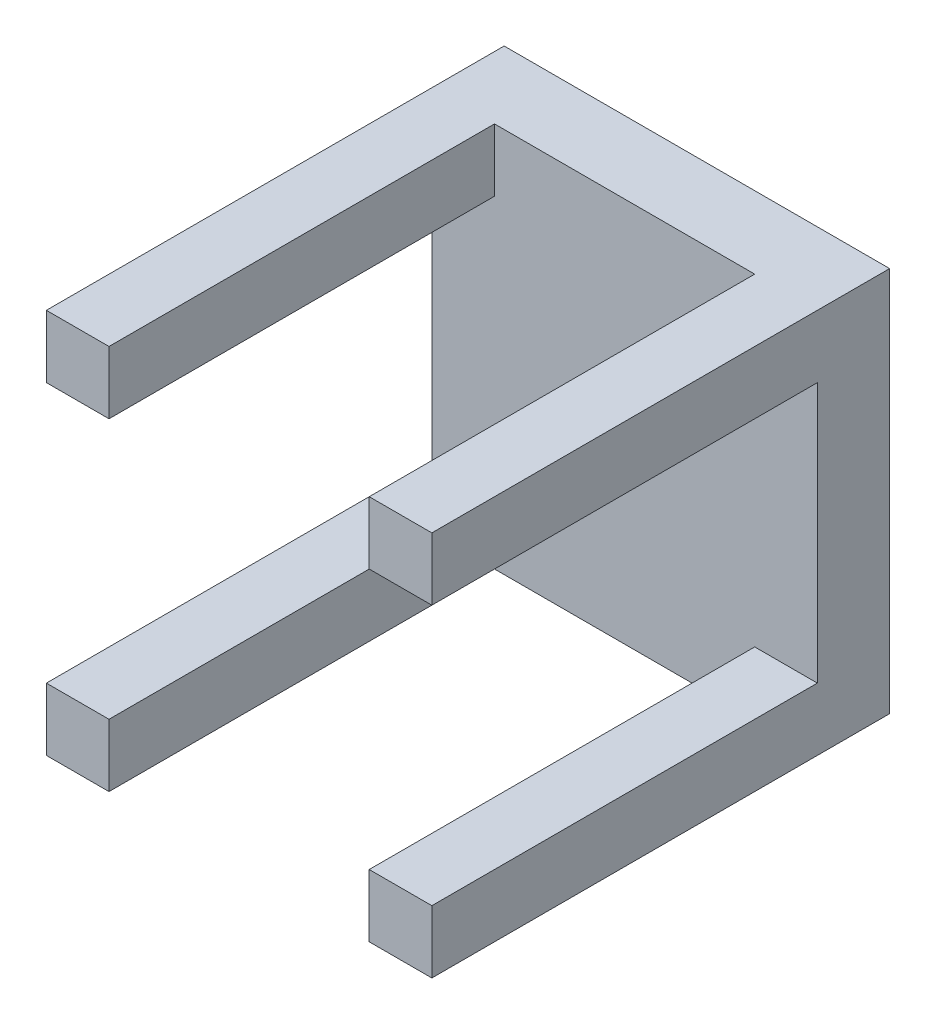
ISO-10303-21;
HEADER;
FILE_DESCRIPTION(('STEP AP214'),'2;1');
FILE_NAME('part.step','',(''),(''),'','','');
FILE_SCHEMA(('AUTOMOTIVE_DESIGN { 1 0 10303 214 1 1 1 1 }'));
ENDSEC;
DATA;
#1=APPLICATION_CONTEXT('core data for automotive mechanical design processes');
#2=APPLICATION_PROTOCOL_DEFINITION('international standard','automotive_design',2000,#1);
#3=PRODUCT_CONTEXT('',#1,'mechanical');
#4=PRODUCT('Part','Part','',(#3));
#5=PRODUCT_RELATED_PRODUCT_CATEGORY('part','',(#4));
#6=PRODUCT_DEFINITION_FORMATION('','',#4);
#7=PRODUCT_DEFINITION_CONTEXT('part definition',#1,'design');
#8=PRODUCT_DEFINITION('design','',#6,#7);
#9=PRODUCT_DEFINITION_SHAPE('','',#8);
#10=(LENGTH_UNIT() NAMED_UNIT(*) SI_UNIT(.MILLI.,.METRE.));
#11=(NAMED_UNIT(*) PLANE_ANGLE_UNIT() SI_UNIT($,.RADIAN.));
#12=(NAMED_UNIT(*) SI_UNIT($,.STERADIAN.) SOLID_ANGLE_UNIT());
#13=UNCERTAINTY_MEASURE_WITH_UNIT(LENGTH_MEASURE(1.E-05),#10,'distance_accuracy_value','');
#14=(GEOMETRIC_REPRESENTATION_CONTEXT(3) GLOBAL_UNCERTAINTY_ASSIGNED_CONTEXT((#13)) GLOBAL_UNIT_ASSIGNED_CONTEXT((#10,
#11,#12)) REPRESENTATION_CONTEXT('',''));
#15=CARTESIAN_POINT('',(0.,0.,0.));
#16=DIRECTION('',(0.,0.,1.));
#17=DIRECTION('',(1.,0.,0.));
#18=AXIS2_PLACEMENT_3D('',#15,#16,#17);
#19=CARTESIAN_POINT('',(0.,0.,15.));
#20=DIRECTION('',(0.,0.,1.));
#21=DIRECTION('',(1.,0.,0.));
#22=AXIS2_PLACEMENT_3D('',#19,#20,#21);
#23=PLANE('',#22);
#24=DIRECTION('',(0.,-1.,0.));
#25=VECTOR('',#24,1.);
#26=CARTESIAN_POINT('',(27.,-40.,15.));
#27=LINE('',#26,#25);
#28=CARTESIAN_POINT('',(27.,-27.,15.));
#29=VERTEX_POINT('',#28);
#30=CARTESIAN_POINT('',(27.,-40.,15.));
#31=VERTEX_POINT('',#30);
#32=EDGE_CURVE('E51',#29,#31,#27,.T.);
#33=ORIENTED_EDGE('',*,*,#32,.F.);
#34=DIRECTION('',(-1.,0.,0.));
#35=VECTOR('',#34,1.);
#36=CARTESIAN_POINT('',(40.,-27.,15.));
#37=LINE('',#36,#35);
#38=CARTESIAN_POINT('',(40.,-27.,15.));
#39=VERTEX_POINT('',#38);
#40=EDGE_CURVE('E55',#39,#29,#37,.T.);
#41=ORIENTED_EDGE('',*,*,#40,.F.);
#42=DIRECTION('',(0.,-1.,0.));
#43=VECTOR('',#42,1.);
#44=CARTESIAN_POINT('',(40.,0.,15.));
#45=LINE('',#44,#43);
#46=CARTESIAN_POINT('',(40.,27.,15.));
#47=VERTEX_POINT('',#46);
#48=EDGE_CURVE('E168',#47,#39,#45,.T.);
#49=ORIENTED_EDGE('',*,*,#48,.F.);
#50=DIRECTION('',(1.,0.,0.));
#51=VECTOR('',#50,1.);
#52=CARTESIAN_POINT('',(40.,27.,15.));
#53=LINE('',#52,#51);
#54=CARTESIAN_POINT('',(27.,27.,15.));
#55=VERTEX_POINT('',#54);
#56=EDGE_CURVE('E203',#55,#47,#53,.T.);
#57=ORIENTED_EDGE('',*,*,#56,.F.);
#58=DIRECTION('',(0.,-1.,0.));
#59=VECTOR('',#58,1.);
#60=CARTESIAN_POINT('',(27.,40.,15.));
#61=LINE('',#60,#59);
#62=CARTESIAN_POINT('',(27.,40.,15.));
#63=VERTEX_POINT('',#62);
#64=EDGE_CURVE('E198',#63,#55,#61,.T.);
#65=ORIENTED_EDGE('',*,*,#64,.F.);
#66=DIRECTION('',(1.,0.,0.));
#67=VECTOR('',#66,1.);
#68=CARTESIAN_POINT('',(0.,40.,15.));
#69=LINE('',#68,#67);
#70=CARTESIAN_POINT('',(-27.,40.,15.));
#71=VERTEX_POINT('',#70);
#72=EDGE_CURVE('E245',#71,#63,#69,.T.);
#73=ORIENTED_EDGE('',*,*,#72,.F.);
#74=DIRECTION('',(0.,1.,0.));
#75=VECTOR('',#74,1.);
#76=CARTESIAN_POINT('',(-27.,40.,15.));
#77=LINE('',#76,#75);
#78=CARTESIAN_POINT('',(-27.,27.,15.));
#79=VERTEX_POINT('',#78);
#80=EDGE_CURVE('E223',#79,#71,#77,.T.);
#81=ORIENTED_EDGE('',*,*,#80,.F.);
#82=DIRECTION('',(1.,0.,0.));
#83=VECTOR('',#82,1.);
#84=CARTESIAN_POINT('',(-40.,27.,15.));
#85=LINE('',#84,#83);
#86=CARTESIAN_POINT('',(-40.,27.,15.));
#87=VERTEX_POINT('',#86);
#88=EDGE_CURVE('E218',#87,#79,#85,.T.);
#89=ORIENTED_EDGE('',*,*,#88,.F.);
#90=DIRECTION('',(0.,-1.,0.));
#91=VECTOR('',#90,1.);
#92=CARTESIAN_POINT('',(-40.,0.,15.));
#93=LINE('',#92,#91);
#94=CARTESIAN_POINT('',(-40.,-27.,15.));
#95=VERTEX_POINT('',#94);
#96=EDGE_CURVE('E249',#87,#95,#93,.T.);
#97=ORIENTED_EDGE('',*,*,#96,.T.);
#98=DIRECTION('',(-1.,0.,0.));
#99=VECTOR('',#98,1.);
#100=CARTESIAN_POINT('',(-40.,-27.,15.));
#101=LINE('',#100,#99);
#102=CARTESIAN_POINT('',(-27.,-27.,15.));
#103=VERTEX_POINT('',#102);
#104=EDGE_CURVE('E172',#103,#95,#101,.T.);
#105=ORIENTED_EDGE('',*,*,#104,.F.);
#106=DIRECTION('',(0.,1.,0.));
#107=VECTOR('',#106,1.);
#108=CARTESIAN_POINT('',(-27.,-40.,15.));
#109=LINE('',#108,#107);
#110=CARTESIAN_POINT('',(-27.,-40.,15.));
#111=VERTEX_POINT('',#110);
#112=EDGE_CURVE('E169',#111,#103,#109,.T.);
#113=ORIENTED_EDGE('',*,*,#112,.F.);
#114=DIRECTION('',(1.,0.,0.));
#115=VECTOR('',#114,1.);
#116=CARTESIAN_POINT('',(0.,-40.,15.));
#117=LINE('',#116,#115);
#118=EDGE_CURVE('E251',#111,#31,#117,.T.);
#119=ORIENTED_EDGE('',*,*,#118,.T.);
#120=EDGE_LOOP('',(#33,#41,#49,#57,#65,#73,#81,#89,#97,#105,#113,#119));
#121=FACE_BOUND('',#120,.T.);
#122=ADVANCED_FACE('F36',(#121),#23,.T.);
#123=CARTESIAN_POINT('',(40.,0.,15.));
#124=DIRECTION('',(1.,0.,0.));
#125=DIRECTION('',(0.,1.,0.));
#126=AXIS2_PLACEMENT_3D('',#123,#124,#125);
#127=PLANE('',#126);
#128=DIRECTION('',(0.,-1.,0.));
#129=VECTOR('',#128,1.);
#130=CARTESIAN_POINT('',(40.,0.,0.));
#131=LINE('',#130,#129);
#132=CARTESIAN_POINT('',(40.,40.,0.));
#133=VERTEX_POINT('',#132);
#134=CARTESIAN_POINT('',(40.,-40.,0.));
#135=VERTEX_POINT('',#134);
#136=EDGE_CURVE('E243',#133,#135,#131,.T.);
#137=ORIENTED_EDGE('',*,*,#136,.F.);
#138=DIRECTION('',(0.,0.,-1.));
#139=VECTOR('',#138,1.);
#140=CARTESIAN_POINT('',(40.,40.,15.));
#141=LINE('',#140,#139);
#142=CARTESIAN_POINT('',(40.,40.,95.));
#143=VERTEX_POINT('',#142);
#144=EDGE_CURVE('E11',#143,#133,#141,.T.);
#145=ORIENTED_EDGE('',*,*,#144,.F.);
#146=DIRECTION('',(0.,1.,0.));
#147=VECTOR('',#146,1.);
#148=CARTESIAN_POINT('',(40.,40.,95.));
#149=LINE('',#148,#147);
#150=CARTESIAN_POINT('',(40.,27.,95.));
#151=VERTEX_POINT('',#150);
#152=EDGE_CURVE('E199',#151,#143,#149,.T.);
#153=ORIENTED_EDGE('',*,*,#152,.F.);
#154=DIRECTION('',(0.,0.,-1.));
#155=VECTOR('',#154,1.);
#156=CARTESIAN_POINT('',(40.,27.,95.));
#157=LINE('',#156,#155);
#158=EDGE_CURVE('E209',#151,#47,#157,.T.);
#159=ORIENTED_EDGE('',*,*,#158,.T.);
#160=ORIENTED_EDGE('',*,*,#48,.T.);
#161=DIRECTION('',(0.,0.,-1.));
#162=VECTOR('',#161,1.);
#163=CARTESIAN_POINT('',(40.,-27.,95.));
#164=LINE('',#163,#162);
#165=CARTESIAN_POINT('',(40.,-27.,95.));
#166=VERTEX_POINT('',#165);
#167=EDGE_CURVE('E151',#166,#39,#164,.T.);
#168=ORIENTED_EDGE('',*,*,#167,.F.);
#169=DIRECTION('',(0.,1.,0.));
#170=VECTOR('',#169,1.);
#171=CARTESIAN_POINT('',(40.,-40.,95.));
#172=LINE('',#171,#170);
#173=CARTESIAN_POINT('',(40.,-40.,95.));
#174=VERTEX_POINT('',#173);
#175=EDGE_CURVE('E157',#174,#166,#172,.T.);
#176=ORIENTED_EDGE('',*,*,#175,.F.);
#177=DIRECTION('',(0.,0.,-1.));
#178=VECTOR('',#177,1.);
#179=CARTESIAN_POINT('',(40.,-40.,15.));
#180=LINE('',#179,#178);
#181=EDGE_CURVE('E253',#174,#135,#180,.T.);
#182=ORIENTED_EDGE('',*,*,#181,.T.);
#183=EDGE_LOOP('',(#137,#145,#153,#159,#160,#168,#176,#182));
#184=FACE_BOUND('',#183,.T.);
#185=ADVANCED_FACE('F38',(#184),#127,.T.);
#186=CARTESIAN_POINT('',(0.,40.,15.));
#187=DIRECTION('',(0.,1.,0.));
#188=DIRECTION('',(0.,0.,1.));
#189=AXIS2_PLACEMENT_3D('',#186,#187,#188);
#190=PLANE('',#189);
#191=DIRECTION('',(1.,0.,0.));
#192=VECTOR('',#191,1.);
#193=CARTESIAN_POINT('',(0.,40.,0.));
#194=LINE('',#193,#192);
#195=CARTESIAN_POINT('',(-40.,40.,0.));
#196=VERTEX_POINT('',#195);
#197=EDGE_CURVE('E256',#196,#133,#194,.T.);
#198=ORIENTED_EDGE('',*,*,#197,.F.);
#199=DIRECTION('',(0.,0.,-1.));
#200=VECTOR('',#199,1.);
#201=CARTESIAN_POINT('',(-40.,40.,15.));
#202=LINE('',#201,#200);
#203=CARTESIAN_POINT('',(-40.,40.,95.));
#204=VERTEX_POINT('',#203);
#205=EDGE_CURVE('E44',#204,#196,#202,.T.);
#206=ORIENTED_EDGE('',*,*,#205,.F.);
#207=DIRECTION('',(-1.,0.,0.));
#208=VECTOR('',#207,1.);
#209=CARTESIAN_POINT('',(-40.,40.,95.));
#210=LINE('',#209,#208);
#211=CARTESIAN_POINT('',(-27.,40.,95.));
#212=VERTEX_POINT('',#211);
#213=EDGE_CURVE('E227',#212,#204,#210,.T.);
#214=ORIENTED_EDGE('',*,*,#213,.F.);
#215=DIRECTION('',(0.,0.,-1.));
#216=VECTOR('',#215,1.);
#217=CARTESIAN_POINT('',(-27.,40.,95.));
#218=LINE('',#217,#216);
#219=EDGE_CURVE('E230',#212,#71,#218,.T.);
#220=ORIENTED_EDGE('',*,*,#219,.T.);
#221=ORIENTED_EDGE('',*,*,#72,.T.);
#222=DIRECTION('',(0.,0.,-1.));
#223=VECTOR('',#222,1.);
#224=CARTESIAN_POINT('',(27.,40.,95.));
#225=LINE('',#224,#223);
#226=CARTESIAN_POINT('',(27.,40.,95.));
#227=VERTEX_POINT('',#226);
#228=EDGE_CURVE('E216',#227,#63,#225,.T.);
#229=ORIENTED_EDGE('',*,*,#228,.F.);
#230=DIRECTION('',(-1.,0.,0.));
#231=VECTOR('',#230,1.);
#232=CARTESIAN_POINT('',(40.,40.,95.));
#233=LINE('',#232,#231);
#234=EDGE_CURVE('E202',#143,#227,#233,.T.);
#235=ORIENTED_EDGE('',*,*,#234,.F.);
#236=ORIENTED_EDGE('',*,*,#144,.T.);
#237=EDGE_LOOP('',(#198,#206,#214,#220,#221,#229,#235,#236));
#238=FACE_BOUND('',#237,.T.);
#239=ADVANCED_FACE('F277',(#238),#190,.T.);
#240=CARTESIAN_POINT('',(-40.,0.,15.));
#241=DIRECTION('',(1.,0.,0.));
#242=DIRECTION('',(0.,1.,0.));
#243=AXIS2_PLACEMENT_3D('',#240,#241,#242);
#244=PLANE('',#243);
#245=DIRECTION('',(0.,-1.,0.));
#246=VECTOR('',#245,1.);
#247=CARTESIAN_POINT('',(-40.,0.,0.));
#248=LINE('',#247,#246);
#249=CARTESIAN_POINT('',(-40.,-40.,0.));
#250=VERTEX_POINT('',#249);
#251=EDGE_CURVE('E259',#196,#250,#248,.T.);
#252=ORIENTED_EDGE('',*,*,#251,.T.);
#253=DIRECTION('',(0.,0.,-1.));
#254=VECTOR('',#253,1.);
#255=CARTESIAN_POINT('',(-40.,-40.,15.));
#256=LINE('',#255,#254);
#257=CARTESIAN_POINT('',(-40.,-40.,95.));
#258=VERTEX_POINT('',#257);
#259=EDGE_CURVE('E264',#258,#250,#256,.T.);
#260=ORIENTED_EDGE('',*,*,#259,.F.);
#261=DIRECTION('',(0.,-1.,0.));
#262=VECTOR('',#261,1.);
#263=CARTESIAN_POINT('',(-40.,-40.,95.));
#264=LINE('',#263,#262);
#265=CARTESIAN_POINT('',(-40.,-27.,95.));
#266=VERTEX_POINT('',#265);
#267=EDGE_CURVE('E178',#266,#258,#264,.T.);
#268=ORIENTED_EDGE('',*,*,#267,.F.);
#269=DIRECTION('',(0.,0.,-1.));
#270=VECTOR('',#269,1.);
#271=CARTESIAN_POINT('',(-40.,-27.,95.));
#272=LINE('',#271,#270);
#273=EDGE_CURVE('E186',#266,#95,#272,.T.);
#274=ORIENTED_EDGE('',*,*,#273,.T.);
#275=ORIENTED_EDGE('',*,*,#96,.F.);
#276=DIRECTION('',(0.,0.,-1.));
#277=VECTOR('',#276,1.);
#278=CARTESIAN_POINT('',(-40.,27.,95.));
#279=LINE('',#278,#277);
#280=CARTESIAN_POINT('',(-40.,27.,95.));
#281=VERTEX_POINT('',#280);
#282=EDGE_CURVE('E240',#281,#87,#279,.T.);
#283=ORIENTED_EDGE('',*,*,#282,.F.);
#284=DIRECTION('',(0.,-1.,0.));
#285=VECTOR('',#284,1.);
#286=CARTESIAN_POINT('',(-40.,40.,95.));
#287=LINE('',#286,#285);
#288=EDGE_CURVE('E219',#204,#281,#287,.T.);
#289=ORIENTED_EDGE('',*,*,#288,.F.);
#290=ORIENTED_EDGE('',*,*,#205,.T.);
#291=EDGE_LOOP('',(#252,#260,#268,#274,#275,#283,#289,#290));
#292=FACE_BOUND('',#291,.T.);
#293=ADVANCED_FACE('F269',(#292),#244,.F.);
#294=CARTESIAN_POINT('',(0.,-40.,15.));
#295=DIRECTION('',(0.,1.,0.));
#296=DIRECTION('',(0.,0.,1.));
#297=AXIS2_PLACEMENT_3D('',#294,#295,#296);
#298=PLANE('',#297);
#299=DIRECTION('',(1.,0.,0.));
#300=VECTOR('',#299,1.);
#301=CARTESIAN_POINT('',(0.,-40.,0.));
#302=LINE('',#301,#300);
#303=EDGE_CURVE('E246',#250,#135,#302,.T.);
#304=ORIENTED_EDGE('',*,*,#303,.T.);
#305=ORIENTED_EDGE('',*,*,#181,.F.);
#306=DIRECTION('',(1.,0.,0.));
#307=VECTOR('',#306,1.);
#308=CARTESIAN_POINT('',(40.,-40.,95.));
#309=LINE('',#308,#307);
#310=CARTESIAN_POINT('',(27.,-40.,95.));
#311=VERTEX_POINT('',#310);
#312=EDGE_CURVE('E163',#311,#174,#309,.T.);
#313=ORIENTED_EDGE('',*,*,#312,.F.);
#314=DIRECTION('',(0.,0.,-1.));
#315=VECTOR('',#314,1.);
#316=CARTESIAN_POINT('',(27.,-40.,95.));
#317=LINE('',#316,#315);
#318=EDGE_CURVE('E174',#311,#31,#317,.T.);
#319=ORIENTED_EDGE('',*,*,#318,.T.);
#320=ORIENTED_EDGE('',*,*,#118,.F.);
#321=DIRECTION('',(0.,0.,-1.));
#322=VECTOR('',#321,1.);
#323=CARTESIAN_POINT('',(-27.,-40.,95.));
#324=LINE('',#323,#322);
#325=CARTESIAN_POINT('',(-27.,-40.,95.));
#326=VERTEX_POINT('',#325);
#327=EDGE_CURVE('E195',#326,#111,#324,.T.);
#328=ORIENTED_EDGE('',*,*,#327,.F.);
#329=DIRECTION('',(1.,0.,0.));
#330=VECTOR('',#329,1.);
#331=CARTESIAN_POINT('',(-40.,-40.,95.));
#332=LINE('',#331,#330);
#333=EDGE_CURVE('E181',#258,#326,#332,.T.);
#334=ORIENTED_EDGE('',*,*,#333,.F.);
#335=ORIENTED_EDGE('',*,*,#259,.T.);
#336=EDGE_LOOP('',(#304,#305,#313,#319,#320,#328,#334,#335));
#337=FACE_BOUND('',#336,.T.);
#338=ADVANCED_FACE('F282',(#337),#298,.F.);
#339=CARTESIAN_POINT('',(0.,0.,0.));
#340=DIRECTION('',(0.,0.,1.));
#341=DIRECTION('',(1.,0.,0.));
#342=AXIS2_PLACEMENT_3D('',#339,#340,#341);
#343=PLANE('',#342);
#344=ORIENTED_EDGE('',*,*,#136,.T.);
#345=ORIENTED_EDGE('',*,*,#303,.F.);
#346=ORIENTED_EDGE('',*,*,#251,.F.);
#347=ORIENTED_EDGE('',*,*,#197,.T.);
#348=EDGE_LOOP('',(#344,#345,#346,#347));
#349=FACE_BOUND('',#348,.T.);
#350=ADVANCED_FACE('F276',(#349),#343,.F.);
#351=CARTESIAN_POINT('',(-40.,27.,95.));
#352=DIRECTION('',(0.,1.,0.));
#353=DIRECTION('',(0.,0.,1.));
#354=AXIS2_PLACEMENT_3D('',#351,#352,#353);
#355=PLANE('',#354);
#356=ORIENTED_EDGE('',*,*,#88,.T.);
#357=DIRECTION('',(0.,0.,-1.));
#358=VECTOR('',#357,1.);
#359=CARTESIAN_POINT('',(-27.,27.,95.));
#360=LINE('',#359,#358);
#361=CARTESIAN_POINT('',(-27.,27.,95.));
#362=VERTEX_POINT('',#361);
#363=EDGE_CURVE('E237',#362,#79,#360,.T.);
#364=ORIENTED_EDGE('',*,*,#363,.F.);
#365=DIRECTION('',(1.,0.,0.));
#366=VECTOR('',#365,1.);
#367=CARTESIAN_POINT('',(-40.,27.,95.));
#368=LINE('',#367,#366);
#369=EDGE_CURVE('E222',#281,#362,#368,.T.);
#370=ORIENTED_EDGE('',*,*,#369,.F.);
#371=ORIENTED_EDGE('',*,*,#282,.T.);
#372=EDGE_LOOP('',(#356,#364,#370,#371));
#373=FACE_BOUND('',#372,.T.);
#374=ADVANCED_FACE('F321',(#373),#355,.F.);
#375=CARTESIAN_POINT('',(-27.,40.,95.));
#376=DIRECTION('',(-1.,0.,0.));
#377=DIRECTION('',(0.,0.,1.));
#378=AXIS2_PLACEMENT_3D('',#375,#376,#377);
#379=PLANE('',#378);
#380=ORIENTED_EDGE('',*,*,#80,.T.);
#381=ORIENTED_EDGE('',*,*,#219,.F.);
#382=DIRECTION('',(0.,1.,0.));
#383=VECTOR('',#382,1.);
#384=CARTESIAN_POINT('',(-27.,40.,95.));
#385=LINE('',#384,#383);
#386=EDGE_CURVE('E225',#362,#212,#385,.T.);
#387=ORIENTED_EDGE('',*,*,#386,.F.);
#388=ORIENTED_EDGE('',*,*,#363,.T.);
#389=EDGE_LOOP('',(#380,#381,#387,#388));
#390=FACE_BOUND('',#389,.T.);
#391=ADVANCED_FACE('F351',(#390),#379,.F.);
#392=CARTESIAN_POINT('',(0.,0.,95.));
#393=DIRECTION('',(0.,0.,1.));
#394=DIRECTION('',(1.,0.,0.));
#395=AXIS2_PLACEMENT_3D('',#392,#393,#394);
#396=PLANE('',#395);
#397=ORIENTED_EDGE('',*,*,#288,.T.);
#398=ORIENTED_EDGE('',*,*,#369,.T.);
#399=ORIENTED_EDGE('',*,*,#386,.T.);
#400=ORIENTED_EDGE('',*,*,#213,.T.);
#401=EDGE_LOOP('',(#397,#398,#399,#400));
#402=FACE_BOUND('',#401,.T.);
#403=ADVANCED_FACE('F358',(#402),#396,.T.);
#404=CARTESIAN_POINT('',(27.,40.,95.));
#405=DIRECTION('',(1.,0.,0.));
#406=DIRECTION('',(0.,0.,-1.));
#407=AXIS2_PLACEMENT_3D('',#404,#405,#406);
#408=PLANE('',#407);
#409=ORIENTED_EDGE('',*,*,#64,.T.);
#410=DIRECTION('',(0.,0.,-1.));
#411=VECTOR('',#410,1.);
#412=CARTESIAN_POINT('',(27.,27.,95.));
#413=LINE('',#412,#411);
#414=CARTESIAN_POINT('',(27.,27.,95.));
#415=VERTEX_POINT('',#414);
#416=EDGE_CURVE('E214',#415,#55,#413,.T.);
#417=ORIENTED_EDGE('',*,*,#416,.F.);
#418=DIRECTION('',(0.,-1.,0.));
#419=VECTOR('',#418,1.);
#420=CARTESIAN_POINT('',(27.,40.,95.));
#421=LINE('',#420,#419);
#422=EDGE_CURVE('E205',#227,#415,#421,.T.);
#423=ORIENTED_EDGE('',*,*,#422,.F.);
#424=ORIENTED_EDGE('',*,*,#228,.T.);
#425=EDGE_LOOP('',(#409,#417,#423,#424));
#426=FACE_BOUND('',#425,.T.);
#427=ADVANCED_FACE('F365',(#426),#408,.F.);
#428=CARTESIAN_POINT('',(40.,27.,95.));
#429=DIRECTION('',(0.,1.,0.));
#430=DIRECTION('',(0.,0.,1.));
#431=AXIS2_PLACEMENT_3D('',#428,#429,#430);
#432=PLANE('',#431);
#433=ORIENTED_EDGE('',*,*,#56,.T.);
#434=ORIENTED_EDGE('',*,*,#158,.F.);
#435=DIRECTION('',(1.,0.,0.));
#436=VECTOR('',#435,1.);
#437=CARTESIAN_POINT('',(40.,27.,95.));
#438=LINE('',#437,#436);
#439=EDGE_CURVE('E207',#415,#151,#438,.T.);
#440=ORIENTED_EDGE('',*,*,#439,.F.);
#441=ORIENTED_EDGE('',*,*,#416,.T.);
#442=EDGE_LOOP('',(#433,#434,#440,#441));
#443=FACE_BOUND('',#442,.T.);
#444=ADVANCED_FACE('F373',(#443),#432,.F.);
#445=CARTESIAN_POINT('',(0.,0.,95.));
#446=DIRECTION('',(0.,0.,-1.));
#447=DIRECTION('',(-1.,0.,0.));
#448=AXIS2_PLACEMENT_3D('',#445,#446,#447);
#449=PLANE('',#448);
#450=ORIENTED_EDGE('',*,*,#152,.T.);
#451=ORIENTED_EDGE('',*,*,#234,.T.);
#452=ORIENTED_EDGE('',*,*,#422,.T.);
#453=ORIENTED_EDGE('',*,*,#439,.T.);
#454=EDGE_LOOP('',(#450,#451,#452,#453));
#455=FACE_BOUND('',#454,.T.);
#456=ADVANCED_FACE('F381',(#455),#449,.F.);
#457=CARTESIAN_POINT('',(-27.,-40.,95.));
#458=DIRECTION('',(-1.,0.,0.));
#459=DIRECTION('',(0.,0.,1.));
#460=AXIS2_PLACEMENT_3D('',#457,#458,#459);
#461=PLANE('',#460);
#462=ORIENTED_EDGE('',*,*,#112,.T.);
#463=DIRECTION('',(0.,0.,-1.));
#464=VECTOR('',#463,1.);
#465=CARTESIAN_POINT('',(-27.,-27.,95.));
#466=LINE('',#465,#464);
#467=CARTESIAN_POINT('',(-27.,-27.,95.));
#468=VERTEX_POINT('',#467);
#469=EDGE_CURVE('E192',#468,#103,#466,.T.);
#470=ORIENTED_EDGE('',*,*,#469,.F.);
#471=DIRECTION('',(0.,1.,0.));
#472=VECTOR('',#471,1.);
#473=CARTESIAN_POINT('',(-27.,-40.,95.));
#474=LINE('',#473,#472);
#475=EDGE_CURVE('E183',#326,#468,#474,.T.);
#476=ORIENTED_EDGE('',*,*,#475,.F.);
#477=ORIENTED_EDGE('',*,*,#327,.T.);
#478=EDGE_LOOP('',(#462,#470,#476,#477));
#479=FACE_BOUND('',#478,.T.);
#480=ADVANCED_FACE('F297',(#479),#461,.F.);
#481=CARTESIAN_POINT('',(-40.,-27.,95.));
#482=DIRECTION('',(0.,-1.,0.));
#483=DIRECTION('',(0.,0.,-1.));
#484=AXIS2_PLACEMENT_3D('',#481,#482,#483);
#485=PLANE('',#484);
#486=ORIENTED_EDGE('',*,*,#104,.T.);
#487=ORIENTED_EDGE('',*,*,#273,.F.);
#488=DIRECTION('',(-1.,0.,0.));
#489=VECTOR('',#488,1.);
#490=CARTESIAN_POINT('',(-40.,-27.,95.));
#491=LINE('',#490,#489);
#492=EDGE_CURVE('E185',#468,#266,#491,.T.);
#493=ORIENTED_EDGE('',*,*,#492,.F.);
#494=ORIENTED_EDGE('',*,*,#469,.T.);
#495=EDGE_LOOP('',(#486,#487,#493,#494));
#496=FACE_BOUND('',#495,.T.);
#497=ADVANCED_FACE('F294',(#496),#485,.F.);
#498=CARTESIAN_POINT('',(0.,0.,95.));
#499=DIRECTION('',(0.,0.,-1.));
#500=DIRECTION('',(-1.,0.,0.));
#501=AXIS2_PLACEMENT_3D('',#498,#499,#500);
#502=PLANE('',#501);
#503=ORIENTED_EDGE('',*,*,#267,.T.);
#504=ORIENTED_EDGE('',*,*,#333,.T.);
#505=ORIENTED_EDGE('',*,*,#475,.T.);
#506=ORIENTED_EDGE('',*,*,#492,.T.);
#507=EDGE_LOOP('',(#503,#504,#505,#506));
#508=FACE_BOUND('',#507,.T.);
#509=ADVANCED_FACE('F289',(#508),#502,.F.);
#510=CARTESIAN_POINT('',(40.,-27.,95.));
#511=DIRECTION('',(0.,-1.,0.));
#512=DIRECTION('',(1.,0.,0.));
#513=AXIS2_PLACEMENT_3D('',#510,#511,#512);
#514=PLANE('',#513);
#515=ORIENTED_EDGE('',*,*,#40,.T.);
#516=DIRECTION('',(0.,0.,-1.));
#517=VECTOR('',#516,1.);
#518=CARTESIAN_POINT('',(27.,-27.,95.));
#519=LINE('',#518,#517);
#520=CARTESIAN_POINT('',(27.,-27.,95.));
#521=VERTEX_POINT('',#520);
#522=EDGE_CURVE('E153',#521,#29,#519,.T.);
#523=ORIENTED_EDGE('',*,*,#522,.F.);
#524=DIRECTION('',(-1.,0.,0.));
#525=VECTOR('',#524,1.);
#526=CARTESIAN_POINT('',(40.,-27.,95.));
#527=LINE('',#526,#525);
#528=EDGE_CURVE('E147',#166,#521,#527,.T.);
#529=ORIENTED_EDGE('',*,*,#528,.F.);
#530=ORIENTED_EDGE('',*,*,#167,.T.);
#531=EDGE_LOOP('',(#515,#523,#529,#530));
#532=FACE_BOUND('',#531,.T.);
#533=ADVANCED_FACE('F149',(#532),#514,.F.);
#534=CARTESIAN_POINT('',(27.,-40.,95.));
#535=DIRECTION('',(1.,0.,0.));
#536=DIRECTION('',(0.,0.,-1.));
#537=AXIS2_PLACEMENT_3D('',#534,#535,#536);
#538=PLANE('',#537);
#539=ORIENTED_EDGE('',*,*,#32,.T.);
#540=ORIENTED_EDGE('',*,*,#318,.F.);
#541=DIRECTION('',(0.,-1.,0.));
#542=VECTOR('',#541,1.);
#543=CARTESIAN_POINT('',(27.,-40.,95.));
#544=LINE('',#543,#542);
#545=EDGE_CURVE('E156',#521,#311,#544,.T.);
#546=ORIENTED_EDGE('',*,*,#545,.F.);
#547=ORIENTED_EDGE('',*,*,#522,.T.);
#548=EDGE_LOOP('',(#539,#540,#546,#547));
#549=FACE_BOUND('',#548,.T.);
#550=ADVANCED_FACE('F301',(#549),#538,.F.);
#551=CARTESIAN_POINT('',(0.,0.,95.));
#552=DIRECTION('',(0.,0.,1.));
#553=DIRECTION('',(1.,0.,0.));
#554=AXIS2_PLACEMENT_3D('',#551,#552,#553);
#555=PLANE('',#554);
#556=ORIENTED_EDGE('',*,*,#175,.T.);
#557=ORIENTED_EDGE('',*,*,#528,.T.);
#558=ORIENTED_EDGE('',*,*,#545,.T.);
#559=ORIENTED_EDGE('',*,*,#312,.T.);
#560=EDGE_LOOP('',(#556,#557,#558,#559));
#561=FACE_BOUND('',#560,.T.);
#562=ADVANCED_FACE('F161',(#561),#555,.T.);
#563=CLOSED_SHELL('',(#122,#185,#239,#293,#338,#350,#374,#391,#403,#427,#444,#456,#480,#497,
#509,#533,#550,#562));
#564=MANIFOLD_SOLID_BREP('B2',#563);
#565=ADVANCED_BREP_SHAPE_REPRESENTATION('',(#18,#564),#14);
#566=SHAPE_DEFINITION_REPRESENTATION(#9,#565);
ENDSEC;
END-ISO-10303-21;
